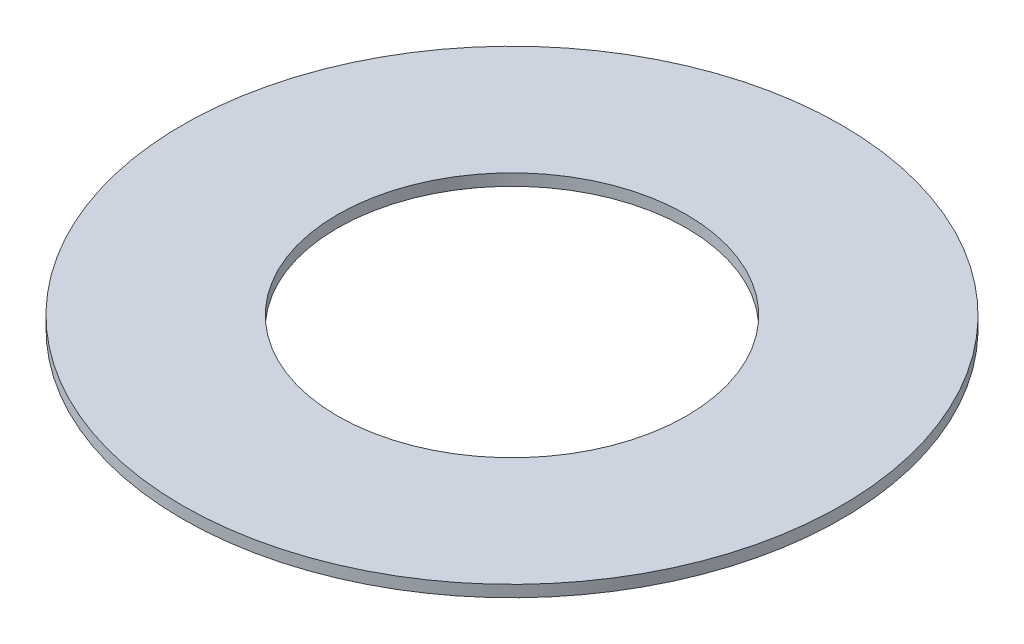
ISO-10303-21;
HEADER;
FILE_DESCRIPTION(('STEP AP214'),'2;1');
FILE_NAME('part.step','',(''),(''),'','','');
FILE_SCHEMA(('AUTOMOTIVE_DESIGN { 1 0 10303 214 1 1 1 1 }'));
ENDSEC;
DATA;
#1=APPLICATION_CONTEXT('core data for automotive mechanical design processes');
#2=APPLICATION_PROTOCOL_DEFINITION('international standard','automotive_design',2000,#1);
#3=PRODUCT_CONTEXT('',#1,'mechanical');
#4=PRODUCT('Part','Part','',(#3));
#5=PRODUCT_RELATED_PRODUCT_CATEGORY('part','',(#4));
#6=PRODUCT_DEFINITION_FORMATION('','',#4);
#7=PRODUCT_DEFINITION_CONTEXT('part definition',#1,'design');
#8=PRODUCT_DEFINITION('design','',#6,#7);
#9=PRODUCT_DEFINITION_SHAPE('','',#8);
#10=(LENGTH_UNIT() NAMED_UNIT(*) SI_UNIT(.MILLI.,.METRE.));
#11=(NAMED_UNIT(*) PLANE_ANGLE_UNIT() SI_UNIT($,.RADIAN.));
#12=(NAMED_UNIT(*) SI_UNIT($,.STERADIAN.) SOLID_ANGLE_UNIT());
#13=UNCERTAINTY_MEASURE_WITH_UNIT(LENGTH_MEASURE(1.E-05),#10,'distance_accuracy_value','');
#14=(GEOMETRIC_REPRESENTATION_CONTEXT(3) GLOBAL_UNCERTAINTY_ASSIGNED_CONTEXT((#13)) GLOBAL_UNIT_ASSIGNED_CONTEXT((#10,
#11,#12)) REPRESENTATION_CONTEXT('',''));
#15=CARTESIAN_POINT('',(0.,0.,0.));
#16=DIRECTION('',(0.,0.,1.));
#17=DIRECTION('',(1.,0.,0.));
#18=AXIS2_PLACEMENT_3D('',#15,#16,#17);
#19=CARTESIAN_POINT('',(0.,0.15,0.));
#20=DIRECTION('',(0.,1.,0.));
#21=DIRECTION('',(0.,0.,1.));
#22=AXIS2_PLACEMENT_3D('',#19,#20,#21);
#23=PLANE('',#22);
#24=CARTESIAN_POINT('',(0.,0.15,0.));
#25=DIRECTION('',(0.,1.,0.));
#26=DIRECTION('',(0.,0.,1.));
#27=AXIS2_PLACEMENT_3D('',#24,#25,#26);
#28=CIRCLE('',#27,8.5);
#29=CARTESIAN_POINT('',(0.,0.15,8.5));
#30=VERTEX_POINT('',#29);
#31=EDGE_CURVE('E10',#30,#30,#28,.T.);
#32=ORIENTED_EDGE('',*,*,#31,.T.);
#33=EDGE_LOOP('',(#32));
#34=FACE_BOUND('',#33,.T.);
#35=CARTESIAN_POINT('',(0.,0.15,0.));
#36=DIRECTION('',(0.,1.,0.));
#37=DIRECTION('',(0.,0.,1.));
#38=AXIS2_PLACEMENT_3D('',#35,#36,#37);
#39=CIRCLE('',#38,4.5);
#40=CARTESIAN_POINT('',(0.,0.15,4.5));
#41=VERTEX_POINT('',#40);
#42=EDGE_CURVE('E45',#41,#41,#39,.T.);
#43=ORIENTED_EDGE('',*,*,#42,.F.);
#44=EDGE_LOOP('',(#43));
#45=FACE_BOUND('',#44,.T.);
#46=ADVANCED_FACE('F34',(#34,#45),#23,.T.);
#47=CARTESIAN_POINT('',(0.,-0.15,0.));
#48=DIRECTION('',(0.,1.,0.));
#49=DIRECTION('',(0.,0.,1.));
#50=AXIS2_PLACEMENT_3D('',#47,#48,#49);
#51=PLANE('',#50);
#52=CARTESIAN_POINT('',(0.,-0.15,0.));
#53=DIRECTION('',(0.,1.,0.));
#54=DIRECTION('',(0.,0.,1.));
#55=AXIS2_PLACEMENT_3D('',#52,#53,#54);
#56=CIRCLE('',#55,8.5);
#57=CARTESIAN_POINT('',(0.,-0.15,8.5));
#58=VERTEX_POINT('',#57);
#59=EDGE_CURVE('E38',#58,#58,#56,.T.);
#60=ORIENTED_EDGE('',*,*,#59,.F.);
#61=EDGE_LOOP('',(#60));
#62=FACE_BOUND('',#61,.T.);
#63=CARTESIAN_POINT('',(0.,-0.15,0.));
#64=DIRECTION('',(0.,1.,0.));
#65=DIRECTION('',(0.,0.,1.));
#66=AXIS2_PLACEMENT_3D('',#63,#64,#65);
#67=CIRCLE('',#66,4.5);
#68=CARTESIAN_POINT('',(0.,-0.15,4.5));
#69=VERTEX_POINT('',#68);
#70=EDGE_CURVE('E47',#69,#69,#67,.T.);
#71=ORIENTED_EDGE('',*,*,#70,.T.);
#72=EDGE_LOOP('',(#71));
#73=FACE_BOUND('',#72,.T.);
#74=ADVANCED_FACE('F57',(#62,#73),#51,.F.);
#75=CARTESIAN_POINT('',(0.,0.15,0.));
#76=DIRECTION('',(0.,-1.,0.));
#77=DIRECTION('',(0.,0.,-1.));
#78=AXIS2_PLACEMENT_3D('',#75,#76,#77);
#79=CYLINDRICAL_SURFACE('',#78,8.5);
#80=ORIENTED_EDGE('',*,*,#31,.F.);
#81=EDGE_LOOP('',(#80));
#82=FACE_BOUND('',#81,.T.);
#83=ORIENTED_EDGE('',*,*,#59,.T.);
#84=EDGE_LOOP('',(#83));
#85=FACE_BOUND('',#84,.T.);
#86=ADVANCED_FACE('F36',(#82,#85),#79,.T.);
#87=CARTESIAN_POINT('',(0.,0.15,0.));
#88=DIRECTION('',(0.,-1.,0.));
#89=DIRECTION('',(0.,0.,-1.));
#90=AXIS2_PLACEMENT_3D('',#87,#88,#89);
#91=CYLINDRICAL_SURFACE('',#90,4.5);
#92=ORIENTED_EDGE('',*,*,#42,.T.);
#93=EDGE_LOOP('',(#92));
#94=FACE_BOUND('',#93,.T.);
#95=ORIENTED_EDGE('',*,*,#70,.F.);
#96=EDGE_LOOP('',(#95));
#97=FACE_BOUND('',#96,.T.);
#98=ADVANCED_FACE('F53',(#94,#97),#91,.F.);
#99=CLOSED_SHELL('',(#46,#74,#86,#98));
#100=MANIFOLD_SOLID_BREP('B2',#99);
#101=ADVANCED_BREP_SHAPE_REPRESENTATION('',(#18,#100),#14);
#102=SHAPE_DEFINITION_REPRESENTATION(#9,#101);
ENDSEC;
END-ISO-10303-21;
